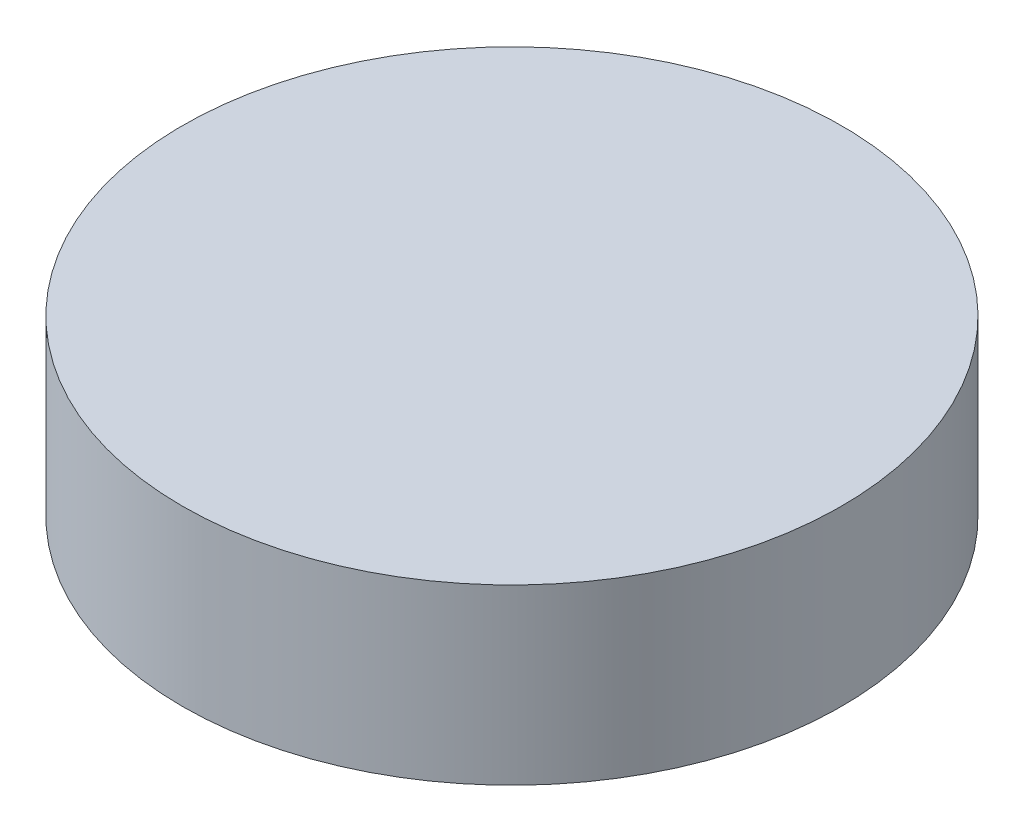
ISO-10303-21;
HEADER;
FILE_DESCRIPTION(('STEP AP214'),'2;1');
FILE_NAME('part.step','',(''),(''),'','','');
FILE_SCHEMA(('AUTOMOTIVE_DESIGN { 1 0 10303 214 1 1 1 1 }'));
ENDSEC;
DATA;
#1=APPLICATION_CONTEXT('core data for automotive mechanical design processes');
#2=APPLICATION_PROTOCOL_DEFINITION('international standard','automotive_design',2000,#1);
#3=PRODUCT_CONTEXT('',#1,'mechanical');
#4=PRODUCT('Part','Part','',(#3));
#5=PRODUCT_RELATED_PRODUCT_CATEGORY('part','',(#4));
#6=PRODUCT_DEFINITION_FORMATION('','',#4);
#7=PRODUCT_DEFINITION_CONTEXT('part definition',#1,'design');
#8=PRODUCT_DEFINITION('design','',#6,#7);
#9=PRODUCT_DEFINITION_SHAPE('','',#8);
#10=(LENGTH_UNIT() NAMED_UNIT(*) SI_UNIT(.MILLI.,.METRE.));
#11=(NAMED_UNIT(*) PLANE_ANGLE_UNIT() SI_UNIT($,.RADIAN.));
#12=(NAMED_UNIT(*) SI_UNIT($,.STERADIAN.) SOLID_ANGLE_UNIT());
#13=UNCERTAINTY_MEASURE_WITH_UNIT(LENGTH_MEASURE(1.E-05),#10,'distance_accuracy_value','');
#14=(GEOMETRIC_REPRESENTATION_CONTEXT(3) GLOBAL_UNCERTAINTY_ASSIGNED_CONTEXT((#13)) GLOBAL_UNIT_ASSIGNED_CONTEXT((#10,
#11,#12)) REPRESENTATION_CONTEXT('',''));
#15=CARTESIAN_POINT('',(0.,0.,0.));
#16=DIRECTION('',(0.,0.,1.));
#17=DIRECTION('',(1.,0.,0.));
#18=AXIS2_PLACEMENT_3D('',#15,#16,#17);
#19=CARTESIAN_POINT('',(4.99965588230111,6.35,4.96193611928675));
#20=DIRECTION('',(0.,-1.,0.));
#21=DIRECTION('',(0.,0.,-1.));
#22=AXIS2_PLACEMENT_3D('',#19,#20,#21);
#23=CYLINDRICAL_SURFACE('',#22,12.065);
#24=CARTESIAN_POINT('',(4.99965588230111,6.35,4.96193611928675));
#25=DIRECTION('',(0.,1.,0.));
#26=DIRECTION('',(0.,0.,1.));
#27=AXIS2_PLACEMENT_3D('',#24,#25,#26);
#28=CIRCLE('',#27,12.065);
#29=CARTESIAN_POINT('',(4.99965588230111,6.35,17.0269361192867));
#30=VERTEX_POINT('',#29);
#31=EDGE_CURVE('E10',#30,#30,#28,.T.);
#32=ORIENTED_EDGE('',*,*,#31,.F.);
#33=EDGE_LOOP('',(#32));
#34=FACE_BOUND('',#33,.T.);
#35=CARTESIAN_POINT('',(4.99965588230111,0.,4.96193611928675));
#36=DIRECTION('',(0.,1.,0.));
#37=DIRECTION('',(0.,0.,1.));
#38=AXIS2_PLACEMENT_3D('',#35,#36,#37);
#39=CIRCLE('',#38,12.065);
#40=CARTESIAN_POINT('',(4.99965588230111,0.,17.0269361192867));
#41=VERTEX_POINT('',#40);
#42=EDGE_CURVE('E36',#41,#41,#39,.T.);
#43=ORIENTED_EDGE('',*,*,#42,.T.);
#44=EDGE_LOOP('',(#43));
#45=FACE_BOUND('',#44,.T.);
#46=ADVANCED_FACE('F33',(#34,#45),#23,.T.);
#47=CARTESIAN_POINT('',(4.99965588230111,6.35,4.96193611928675));
#48=DIRECTION('',(0.,1.,0.));
#49=DIRECTION('',(0.,0.,1.));
#50=AXIS2_PLACEMENT_3D('',#47,#48,#49);
#51=PLANE('',#50);
#52=ORIENTED_EDGE('',*,*,#31,.T.);
#53=EDGE_LOOP('',(#52));
#54=FACE_BOUND('',#53,.T.);
#55=ADVANCED_FACE('F48',(#54),#51,.T.);
#56=CARTESIAN_POINT('',(4.99965588230111,0.,4.96193611928675));
#57=DIRECTION('',(0.,1.,0.));
#58=DIRECTION('',(0.,0.,1.));
#59=AXIS2_PLACEMENT_3D('',#56,#57,#58);
#60=PLANE('',#59);
#61=ORIENTED_EDGE('',*,*,#42,.F.);
#62=EDGE_LOOP('',(#61));
#63=FACE_BOUND('',#62,.T.);
#64=ADVANCED_FACE('F46',(#63),#60,.F.);
#65=CLOSED_SHELL('',(#46,#55,#64));
#66=MANIFOLD_SOLID_BREP('B2',#65);
#67=ADVANCED_BREP_SHAPE_REPRESENTATION('',(#18,#66),#14);
#68=SHAPE_DEFINITION_REPRESENTATION(#9,#67);
ENDSEC;
END-ISO-10303-21;
